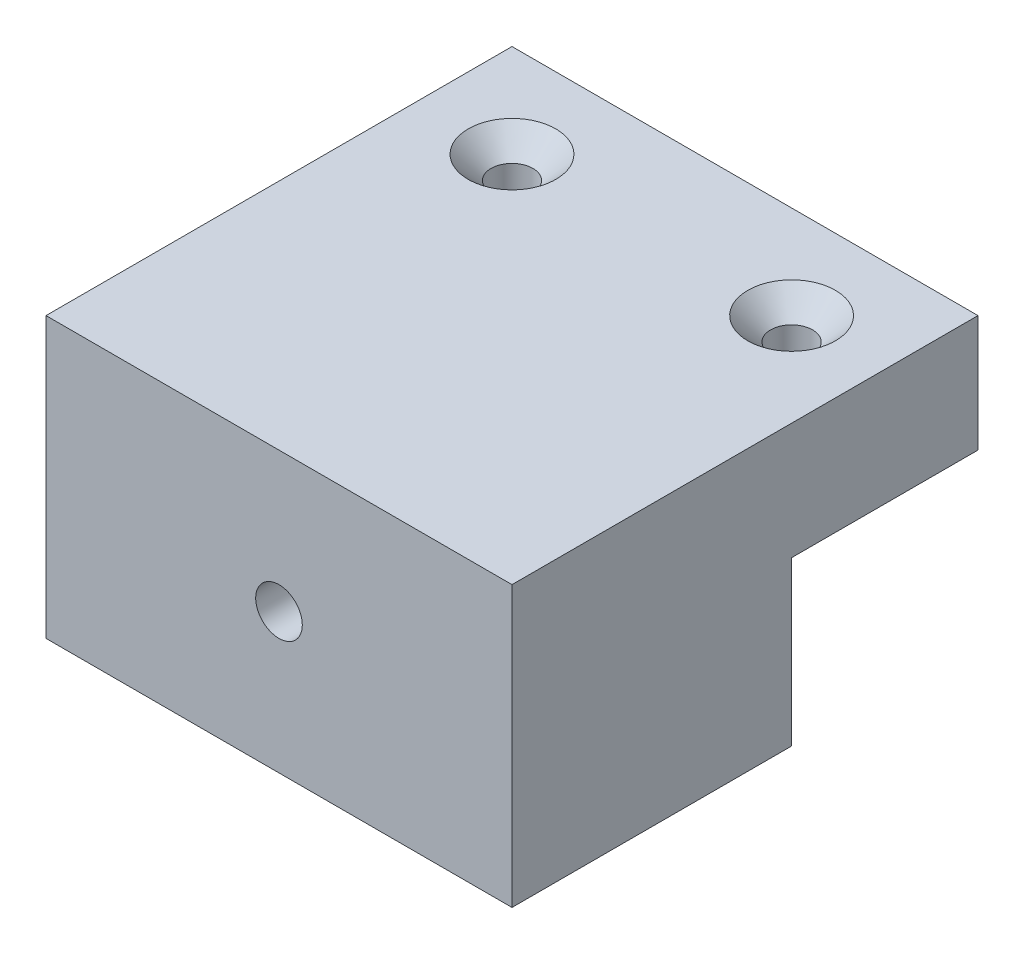
ISO-10303-21;
HEADER;
FILE_DESCRIPTION(('STEP AP214'),'2;1');
FILE_NAME('part.step','',(''),(''),'','','');
FILE_SCHEMA(('AUTOMOTIVE_DESIGN { 1 0 10303 214 1 1 1 1 }'));
ENDSEC;
DATA;
#1=APPLICATION_CONTEXT('core data for automotive mechanical design processes');
#2=APPLICATION_PROTOCOL_DEFINITION('international standard','automotive_design',2000,#1);
#3=PRODUCT_CONTEXT('',#1,'mechanical');
#4=PRODUCT('Part','Part','',(#3));
#5=PRODUCT_RELATED_PRODUCT_CATEGORY('part','',(#4));
#6=PRODUCT_DEFINITION_FORMATION('','',#4);
#7=PRODUCT_DEFINITION_CONTEXT('part definition',#1,'design');
#8=PRODUCT_DEFINITION('design','',#6,#7);
#9=PRODUCT_DEFINITION_SHAPE('','',#8);
#10=(LENGTH_UNIT() NAMED_UNIT(*) SI_UNIT(.MILLI.,.METRE.));
#11=(NAMED_UNIT(*) PLANE_ANGLE_UNIT() SI_UNIT($,.RADIAN.));
#12=(NAMED_UNIT(*) SI_UNIT($,.STERADIAN.) SOLID_ANGLE_UNIT());
#13=UNCERTAINTY_MEASURE_WITH_UNIT(LENGTH_MEASURE(1.E-05),#10,'distance_accuracy_value','');
#14=(GEOMETRIC_REPRESENTATION_CONTEXT(3) GLOBAL_UNCERTAINTY_ASSIGNED_CONTEXT((#13)) GLOBAL_UNIT_ASSIGNED_CONTEXT((#10,
#11,#12)) REPRESENTATION_CONTEXT('',''));
#15=CARTESIAN_POINT('',(0.,0.,0.));
#16=DIRECTION('',(0.,0.,1.));
#17=DIRECTION('',(1.,0.,0.));
#18=AXIS2_PLACEMENT_3D('',#15,#16,#17);
#19=CARTESIAN_POINT('',(25.,15.,30.));
#20=DIRECTION('',(0.,0.,1.));
#21=DIRECTION('',(1.,0.,0.));
#22=AXIS2_PLACEMENT_3D('',#19,#20,#21);
#23=PLANE('',#22);
#24=CARTESIAN_POINT('',(25.,15.,30.));
#25=DIRECTION('',(0.,0.,1.));
#26=DIRECTION('',(1.,0.,0.));
#27=AXIS2_PLACEMENT_3D('',#24,#25,#26);
#28=CIRCLE('',#27,2.5);
#29=CARTESIAN_POINT('',(27.5,15.,30.));
#30=VERTEX_POINT('',#29);
#31=EDGE_CURVE('E20',#30,#30,#28,.T.);
#32=ORIENTED_EDGE('',*,*,#31,.T.);
#33=EDGE_LOOP('',(#32));
#34=FACE_BOUND('',#33,.T.);
#35=ADVANCED_FACE('F17',(#34),#23,.T.);
#36=CARTESIAN_POINT('',(40.,30.,10.));
#37=DIRECTION('',(0.,1.,0.));
#38=DIRECTION('',(0.,0.,1.));
#39=AXIS2_PLACEMENT_3D('',#36,#37,#38);
#40=CYLINDRICAL_SURFACE('',#39,2.25);
#41=CARTESIAN_POINT('',(40.,17.5,10.));
#42=DIRECTION('',(0.,1.,0.));
#43=DIRECTION('',(0.,0.,1.));
#44=AXIS2_PLACEMENT_3D('',#41,#42,#43);
#45=CIRCLE('',#44,2.25);
#46=CARTESIAN_POINT('',(40.,17.5,12.25));
#47=VERTEX_POINT('',#46);
#48=EDGE_CURVE('E89',#47,#47,#45,.F.);
#49=ORIENTED_EDGE('',*,*,#48,.T.);
#50=EDGE_LOOP('',(#49));
#51=FACE_BOUND('',#50,.T.);
#52=CARTESIAN_POINT('',(40.,27.5499999999624,10.));
#53=DIRECTION('',(0.,1.,0.));
#54=DIRECTION('',(0.,0.,1.));
#55=AXIS2_PLACEMENT_3D('',#52,#53,#54);
#56=CIRCLE('',#55,2.24999999999454);
#57=CARTESIAN_POINT('',(40.,27.5499999999624,12.2499999999945));
#58=VERTEX_POINT('',#57);
#59=EDGE_CURVE('E100',#58,#58,#56,.T.);
#60=ORIENTED_EDGE('',*,*,#59,.T.);
#61=EDGE_LOOP('',(#60));
#62=FACE_BOUND('',#61,.T.);
#63=ADVANCED_FACE('F119',(#51,#62),#40,.F.);
#64=CARTESIAN_POINT('',(10.,30.,10.));
#65=DIRECTION('',(0.,1.,0.));
#66=DIRECTION('',(0.,0.,1.));
#67=AXIS2_PLACEMENT_3D('',#64,#65,#66);
#68=CYLINDRICAL_SURFACE('',#67,2.25);
#69=CARTESIAN_POINT('',(10.,17.5,10.));
#70=DIRECTION('',(0.,1.,0.));
#71=DIRECTION('',(0.,0.,1.));
#72=AXIS2_PLACEMENT_3D('',#69,#70,#71);
#73=CIRCLE('',#72,2.25);
#74=CARTESIAN_POINT('',(10.,17.5,12.25));
#75=VERTEX_POINT('',#74);
#76=EDGE_CURVE('E101',#75,#75,#73,.F.);
#77=ORIENTED_EDGE('',*,*,#76,.T.);
#78=EDGE_LOOP('',(#77));
#79=FACE_BOUND('',#78,.T.);
#80=CARTESIAN_POINT('',(10.,27.5499999999624,10.));
#81=DIRECTION('',(0.,1.,0.));
#82=DIRECTION('',(0.,0.,1.));
#83=AXIS2_PLACEMENT_3D('',#80,#81,#82);
#84=CIRCLE('',#83,2.24999999999454);
#85=CARTESIAN_POINT('',(10.,27.5499999999624,12.2499999999945));
#86=VERTEX_POINT('',#85);
#87=EDGE_CURVE('E81',#86,#86,#84,.T.);
#88=ORIENTED_EDGE('',*,*,#87,.T.);
#89=EDGE_LOOP('',(#88));
#90=FACE_BOUND('',#89,.T.);
#91=ADVANCED_FACE('F170',(#79,#90),#68,.F.);
#92=CARTESIAN_POINT('',(25.,15.,30.));
#93=DIRECTION('',(0.,0.,1.));
#94=DIRECTION('',(1.,0.,0.));
#95=AXIS2_PLACEMENT_3D('',#92,#93,#94);
#96=CYLINDRICAL_SURFACE('',#95,2.5);
#97=ORIENTED_EDGE('',*,*,#31,.F.);
#98=EDGE_LOOP('',(#97));
#99=FACE_BOUND('',#98,.T.);
#100=CARTESIAN_POINT('',(25.,15.,50.));
#101=DIRECTION('',(0.,0.,1.));
#102=DIRECTION('',(1.,0.,0.));
#103=AXIS2_PLACEMENT_3D('',#100,#101,#102);
#104=CIRCLE('',#103,2.5);
#105=CARTESIAN_POINT('',(27.5,15.,50.));
#106=VERTEX_POINT('',#105);
#107=EDGE_CURVE('E92',#106,#106,#104,.T.);
#108=ORIENTED_EDGE('',*,*,#107,.T.);
#109=EDGE_LOOP('',(#108));
#110=FACE_BOUND('',#109,.T.);
#111=ADVANCED_FACE('F172',(#99,#110),#96,.F.);
#112=CARTESIAN_POINT('',(0.,0.,50.));
#113=DIRECTION('',(0.,1.,0.));
#114=DIRECTION('',(0.,0.,1.));
#115=AXIS2_PLACEMENT_3D('',#112,#113,#114);
#116=PLANE('',#115);
#117=DIRECTION('',(0.,0.,1.));
#118=VECTOR('',#117,1.);
#119=CARTESIAN_POINT('',(50.,0.,50.));
#120=LINE('',#119,#118);
#121=CARTESIAN_POINT('',(50.,0.,20.));
#122=VERTEX_POINT('',#121);
#123=CARTESIAN_POINT('',(50.,0.,50.));
#124=VERTEX_POINT('',#123);
#125=EDGE_CURVE('E71',#122,#124,#120,.T.);
#126=ORIENTED_EDGE('',*,*,#125,.T.);
#127=DIRECTION('',(-1.,0.,0.));
#128=VECTOR('',#127,1.);
#129=CARTESIAN_POINT('',(0.,0.,50.));
#130=LINE('',#129,#128);
#131=CARTESIAN_POINT('',(0.,0.,50.));
#132=VERTEX_POINT('',#131);
#133=EDGE_CURVE('E275',#124,#132,#130,.T.);
#134=ORIENTED_EDGE('',*,*,#133,.T.);
#135=DIRECTION('',(0.,0.,-1.));
#136=VECTOR('',#135,1.);
#137=CARTESIAN_POINT('',(0.,0.,50.));
#138=LINE('',#137,#136);
#139=CARTESIAN_POINT('',(0.,0.,20.));
#140=VERTEX_POINT('',#139);
#141=EDGE_CURVE('E87',#132,#140,#138,.T.);
#142=ORIENTED_EDGE('',*,*,#141,.T.);
#143=DIRECTION('',(-1.,0.,0.));
#144=VECTOR('',#143,1.);
#145=CARTESIAN_POINT('',(0.,0.,20.));
#146=LINE('',#145,#144);
#147=EDGE_CURVE('E84',#122,#140,#146,.T.);
#148=ORIENTED_EDGE('',*,*,#147,.F.);
#149=EDGE_LOOP('',(#126,#134,#142,#148));
#150=FACE_BOUND('',#149,.T.);
#151=ADVANCED_FACE('F85',(#150),#116,.F.);
#152=CARTESIAN_POINT('',(0.,0.,20.));
#153=DIRECTION('',(0.,0.,-1.));
#154=DIRECTION('',(-1.,0.,0.));
#155=AXIS2_PLACEMENT_3D('',#152,#153,#154);
#156=PLANE('',#155);
#157=ORIENTED_EDGE('',*,*,#147,.T.);
#158=DIRECTION('',(0.,1.,0.));
#159=VECTOR('',#158,1.);
#160=CARTESIAN_POINT('',(0.,0.,20.));
#161=LINE('',#160,#159);
#162=CARTESIAN_POINT('',(0.,17.5,20.));
#163=VERTEX_POINT('',#162);
#164=EDGE_CURVE('E282',#140,#163,#161,.T.);
#165=ORIENTED_EDGE('',*,*,#164,.T.);
#166=DIRECTION('',(1.,0.,0.));
#167=VECTOR('',#166,1.);
#168=CARTESIAN_POINT('',(50.,17.5,20.));
#169=LINE('',#168,#167);
#170=CARTESIAN_POINT('',(50.,17.5,20.));
#171=VERTEX_POINT('',#170);
#172=EDGE_CURVE('E66',#163,#171,#169,.T.);
#173=ORIENTED_EDGE('',*,*,#172,.T.);
#174=DIRECTION('',(0.,1.,0.));
#175=VECTOR('',#174,1.);
#176=CARTESIAN_POINT('',(50.,0.,20.));
#177=LINE('',#176,#175);
#178=EDGE_CURVE('E74',#171,#122,#177,.F.);
#179=ORIENTED_EDGE('',*,*,#178,.T.);
#180=EDGE_LOOP('',(#157,#165,#173,#179));
#181=FACE_BOUND('',#180,.T.);
#182=ADVANCED_FACE('F91',(#181),#156,.T.);
#183=CARTESIAN_POINT('',(50.,17.5,20.));
#184=DIRECTION('',(0.,1.,0.));
#185=DIRECTION('',(0.,0.,1.));
#186=AXIS2_PLACEMENT_3D('',#183,#184,#185);
#187=PLANE('',#186);
#188=DIRECTION('',(0.,0.,1.));
#189=VECTOR('',#188,1.);
#190=CARTESIAN_POINT('',(50.,17.5,50.));
#191=LINE('',#190,#189);
#192=CARTESIAN_POINT('',(50.,17.5,0.));
#193=VERTEX_POINT('',#192);
#194=EDGE_CURVE('E80',#193,#171,#191,.T.);
#195=ORIENTED_EDGE('',*,*,#194,.T.);
#196=ORIENTED_EDGE('',*,*,#172,.F.);
#197=DIRECTION('',(0.,0.,-1.));
#198=VECTOR('',#197,1.);
#199=CARTESIAN_POINT('',(0.,17.5,50.));
#200=LINE('',#199,#198);
#201=CARTESIAN_POINT('',(0.,17.5,0.));
#202=VERTEX_POINT('',#201);
#203=EDGE_CURVE('E284',#163,#202,#200,.T.);
#204=ORIENTED_EDGE('',*,*,#203,.T.);
#205=DIRECTION('',(-1.,0.,0.));
#206=VECTOR('',#205,1.);
#207=CARTESIAN_POINT('',(0.,17.5,0.));
#208=LINE('',#207,#206);
#209=EDGE_CURVE('E287',#193,#202,#208,.T.);
#210=ORIENTED_EDGE('',*,*,#209,.F.);
#211=EDGE_LOOP('',(#195,#196,#204,#210));
#212=FACE_BOUND('',#211,.T.);
#213=ORIENTED_EDGE('',*,*,#76,.F.);
#214=EDGE_LOOP('',(#213));
#215=FACE_BOUND('',#214,.T.);
#216=ORIENTED_EDGE('',*,*,#48,.F.);
#217=EDGE_LOOP('',(#216));
#218=FACE_BOUND('',#217,.T.);
#219=ADVANCED_FACE('F122',(#212,#215,#218),#187,.F.);
#220=CARTESIAN_POINT('',(40.,29.999999999859,10.));
#221=DIRECTION('',(0.,1.,0.));
#222=DIRECTION('',(-1.,0.,0.));
#223=AXIS2_PLACEMENT_3D('',#220,#221,#222);
#224=CONICAL_SURFACE('',#223,4.69999999989113,0.785398163397448);
#225=ORIENTED_EDGE('',*,*,#59,.F.);
#226=EDGE_LOOP('',(#225));
#227=FACE_BOUND('',#226,.T.);
#228=CARTESIAN_POINT('',(40.,29.9999999999727,10.));
#229=DIRECTION('',(0.,1.,0.));
#230=DIRECTION('',(-1.,0.,0.));
#231=AXIS2_PLACEMENT_3D('',#228,#229,#230);
#232=CIRCLE('',#231,4.70000000000482);
#233=CARTESIAN_POINT('',(35.2999999999952,29.9999999999727,10.));
#234=VERTEX_POINT('',#233);
#235=EDGE_CURVE('E111',#234,#234,#232,.T.);
#236=ORIENTED_EDGE('',*,*,#235,.T.);
#237=EDGE_LOOP('',(#236));
#238=FACE_BOUND('',#237,.T.);
#239=ADVANCED_FACE('F124',(#227,#238),#224,.F.);
#240=CARTESIAN_POINT('',(10.,29.999999999859,10.));
#241=DIRECTION('',(0.,1.,0.));
#242=DIRECTION('',(-1.,0.,0.));
#243=AXIS2_PLACEMENT_3D('',#240,#241,#242);
#244=CONICAL_SURFACE('',#243,4.69999999989113,0.785398163397448);
#245=ORIENTED_EDGE('',*,*,#87,.F.);
#246=EDGE_LOOP('',(#245));
#247=FACE_BOUND('',#246,.T.);
#248=CARTESIAN_POINT('',(10.,29.9999999999727,10.));
#249=DIRECTION('',(0.,1.,0.));
#250=DIRECTION('',(-1.,0.,0.));
#251=AXIS2_PLACEMENT_3D('',#248,#249,#250);
#252=CIRCLE('',#251,4.70000000000482);
#253=CARTESIAN_POINT('',(5.29999999999518,29.9999999999727,10.));
#254=VERTEX_POINT('',#253);
#255=EDGE_CURVE('E107',#254,#254,#252,.T.);
#256=ORIENTED_EDGE('',*,*,#255,.T.);
#257=EDGE_LOOP('',(#256));
#258=FACE_BOUND('',#257,.T.);
#259=ADVANCED_FACE('F132',(#247,#258),#244,.F.);
#260=CARTESIAN_POINT('',(50.,0.,50.));
#261=DIRECTION('',(-1.,0.,0.));
#262=DIRECTION('',(0.,0.,1.));
#263=AXIS2_PLACEMENT_3D('',#260,#261,#262);
#264=PLANE('',#263);
#265=ORIENTED_EDGE('',*,*,#194,.F.);
#266=DIRECTION('',(0.,1.,0.));
#267=VECTOR('',#266,1.);
#268=CARTESIAN_POINT('',(50.,0.,0.));
#269=LINE('',#268,#267);
#270=CARTESIAN_POINT('',(50.,30.,0.));
#271=VERTEX_POINT('',#270);
#272=EDGE_CURVE('E113',#271,#193,#269,.F.);
#273=ORIENTED_EDGE('',*,*,#272,.F.);
#274=DIRECTION('',(0.,0.,-1.));
#275=VECTOR('',#274,1.);
#276=CARTESIAN_POINT('',(50.,30.,50.));
#277=LINE('',#276,#275);
#278=CARTESIAN_POINT('',(50.,30.,50.));
#279=VERTEX_POINT('',#278);
#280=EDGE_CURVE('E110',#271,#279,#277,.F.);
#281=ORIENTED_EDGE('',*,*,#280,.T.);
#282=DIRECTION('',(0.,1.,0.));
#283=VECTOR('',#282,1.);
#284=CARTESIAN_POINT('',(50.,0.,50.));
#285=LINE('',#284,#283);
#286=EDGE_CURVE('E77',#279,#124,#285,.F.);
#287=ORIENTED_EDGE('',*,*,#286,.T.);
#288=ORIENTED_EDGE('',*,*,#125,.F.);
#289=ORIENTED_EDGE('',*,*,#178,.F.);
#290=EDGE_LOOP('',(#265,#273,#281,#287,#288,#289));
#291=FACE_BOUND('',#290,.T.);
#292=ADVANCED_FACE('F73',(#291),#264,.F.);
#293=CARTESIAN_POINT('',(0.,0.,50.));
#294=DIRECTION('',(0.,0.,-1.));
#295=DIRECTION('',(-1.,0.,0.));
#296=AXIS2_PLACEMENT_3D('',#293,#294,#295);
#297=PLANE('',#296);
#298=ORIENTED_EDGE('',*,*,#133,.F.);
#299=ORIENTED_EDGE('',*,*,#286,.F.);
#300=DIRECTION('',(1.,0.,0.));
#301=VECTOR('',#300,1.);
#302=CARTESIAN_POINT('',(0.,30.,50.));
#303=LINE('',#302,#301);
#304=CARTESIAN_POINT('',(0.,30.,50.));
#305=VERTEX_POINT('',#304);
#306=EDGE_CURVE('E293',#279,#305,#303,.F.);
#307=ORIENTED_EDGE('',*,*,#306,.T.);
#308=DIRECTION('',(0.,1.,0.));
#309=VECTOR('',#308,1.);
#310=CARTESIAN_POINT('',(0.,0.,50.));
#311=LINE('',#310,#309);
#312=EDGE_CURVE('E278',#305,#132,#311,.F.);
#313=ORIENTED_EDGE('',*,*,#312,.T.);
#314=EDGE_LOOP('',(#298,#299,#307,#313));
#315=FACE_BOUND('',#314,.T.);
#316=ORIENTED_EDGE('',*,*,#107,.F.);
#317=EDGE_LOOP('',(#316));
#318=FACE_BOUND('',#317,.T.);
#319=ADVANCED_FACE('F152',(#315,#318),#297,.F.);
#320=CARTESIAN_POINT('',(0.,0.,50.));
#321=DIRECTION('',(1.,0.,0.));
#322=DIRECTION('',(0.,0.,-1.));
#323=AXIS2_PLACEMENT_3D('',#320,#321,#322);
#324=PLANE('',#323);
#325=ORIENTED_EDGE('',*,*,#203,.F.);
#326=ORIENTED_EDGE('',*,*,#164,.F.);
#327=ORIENTED_EDGE('',*,*,#141,.F.);
#328=ORIENTED_EDGE('',*,*,#312,.F.);
#329=DIRECTION('',(0.,0.,-1.));
#330=VECTOR('',#329,1.);
#331=CARTESIAN_POINT('',(0.,30.,50.));
#332=LINE('',#331,#330);
#333=CARTESIAN_POINT('',(0.,30.,0.));
#334=VERTEX_POINT('',#333);
#335=EDGE_CURVE('E26',#305,#334,#332,.T.);
#336=ORIENTED_EDGE('',*,*,#335,.T.);
#337=DIRECTION('',(0.,1.,0.));
#338=VECTOR('',#337,1.);
#339=CARTESIAN_POINT('',(0.,0.,0.));
#340=LINE('',#339,#338);
#341=EDGE_CURVE('E34',#202,#334,#340,.T.);
#342=ORIENTED_EDGE('',*,*,#341,.F.);
#343=EDGE_LOOP('',(#325,#326,#327,#328,#336,#342));
#344=FACE_BOUND('',#343,.T.);
#345=ADVANCED_FACE('F145',(#344),#324,.F.);
#346=CARTESIAN_POINT('',(0.,0.,0.));
#347=DIRECTION('',(0.,0.,-1.));
#348=DIRECTION('',(-1.,0.,0.));
#349=AXIS2_PLACEMENT_3D('',#346,#347,#348);
#350=PLANE('',#349);
#351=DIRECTION('',(1.,0.,0.));
#352=VECTOR('',#351,1.);
#353=CARTESIAN_POINT('',(0.,30.,0.));
#354=LINE('',#353,#352);
#355=EDGE_CURVE('E11',#334,#271,#354,.T.);
#356=ORIENTED_EDGE('',*,*,#355,.T.);
#357=ORIENTED_EDGE('',*,*,#272,.T.);
#358=ORIENTED_EDGE('',*,*,#209,.T.);
#359=ORIENTED_EDGE('',*,*,#341,.T.);
#360=EDGE_LOOP('',(#356,#357,#358,#359));
#361=FACE_BOUND('',#360,.T.);
#362=ADVANCED_FACE('F139',(#361),#350,.T.);
#363=CARTESIAN_POINT('',(0.,30.,50.));
#364=DIRECTION('',(0.,-1.,0.));
#365=DIRECTION('',(0.,0.,-1.));
#366=AXIS2_PLACEMENT_3D('',#363,#364,#365);
#367=PLANE('',#366);
#368=ORIENTED_EDGE('',*,*,#335,.F.);
#369=ORIENTED_EDGE('',*,*,#306,.F.);
#370=ORIENTED_EDGE('',*,*,#280,.F.);
#371=ORIENTED_EDGE('',*,*,#355,.F.);
#372=EDGE_LOOP('',(#368,#369,#370,#371));
#373=FACE_BOUND('',#372,.T.);
#374=ORIENTED_EDGE('',*,*,#255,.F.);
#375=EDGE_LOOP('',(#374));
#376=FACE_BOUND('',#375,.T.);
#377=ORIENTED_EDGE('',*,*,#235,.F.);
#378=EDGE_LOOP('',(#377));
#379=FACE_BOUND('',#378,.T.);
#380=ADVANCED_FACE('F137',(#373,#376,#379),#367,.F.);
#381=CLOSED_SHELL('',(#35,#63,#91,#111,#151,#182,#219,#239,#259,#292,#319,#345,#362,#380));
#382=MANIFOLD_SOLID_BREP('B1',#381);
#383=ADVANCED_BREP_SHAPE_REPRESENTATION('',(#18,#382),#14);
#384=SHAPE_DEFINITION_REPRESENTATION(#9,#383);
ENDSEC;
END-ISO-10303-21;
